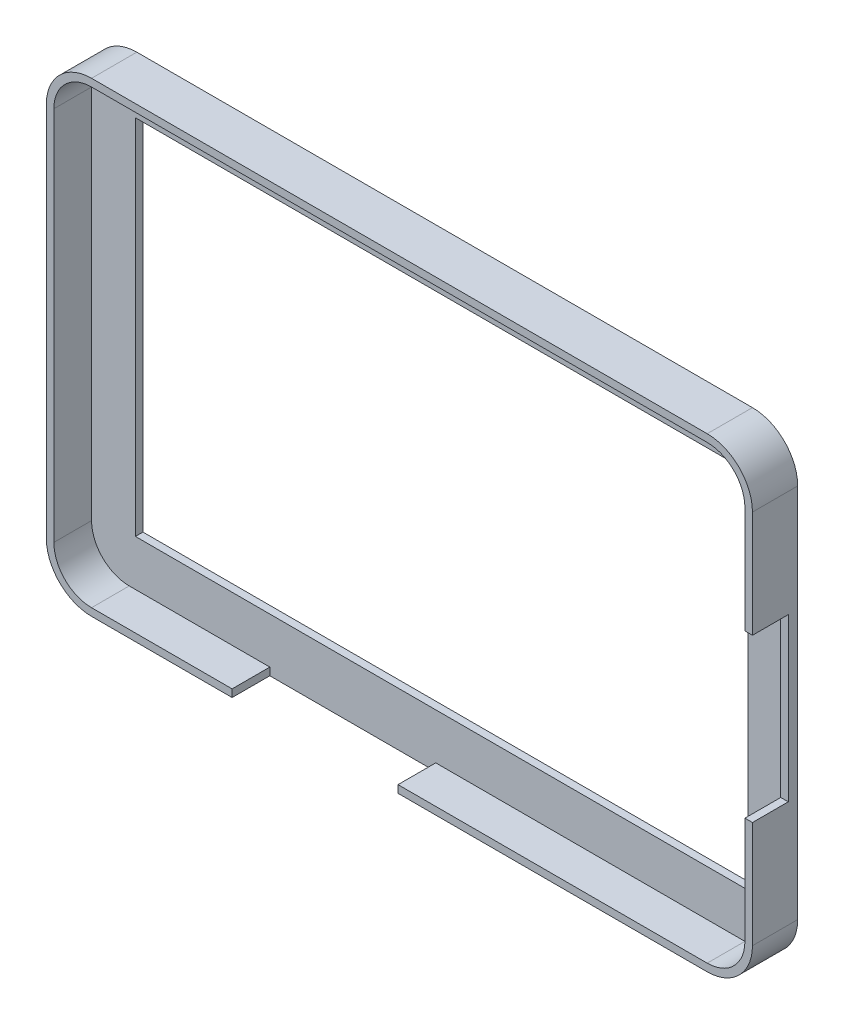
ISO-10303-21;
HEADER;
FILE_DESCRIPTION(('STEP AP214'),'2;1');
FILE_NAME('part.step','',(''),(''),'','','');
FILE_SCHEMA(('AUTOMOTIVE_DESIGN { 1 0 10303 214 1 1 1 1 }'));
ENDSEC;
DATA;
#1=APPLICATION_CONTEXT('core data for automotive mechanical design processes');
#2=APPLICATION_PROTOCOL_DEFINITION('international standard','automotive_design',2000,#1);
#3=PRODUCT_CONTEXT('',#1,'mechanical');
#4=PRODUCT('Part','Part','',(#3));
#5=PRODUCT_RELATED_PRODUCT_CATEGORY('part','',(#4));
#6=PRODUCT_DEFINITION_FORMATION('','',#4);
#7=PRODUCT_DEFINITION_CONTEXT('part definition',#1,'design');
#8=PRODUCT_DEFINITION('design','',#6,#7);
#9=PRODUCT_DEFINITION_SHAPE('','',#8);
#10=(LENGTH_UNIT() NAMED_UNIT(*) SI_UNIT(.MILLI.,.METRE.));
#11=(NAMED_UNIT(*) PLANE_ANGLE_UNIT() SI_UNIT($,.RADIAN.));
#12=(NAMED_UNIT(*) SI_UNIT($,.STERADIAN.) SOLID_ANGLE_UNIT());
#13=UNCERTAINTY_MEASURE_WITH_UNIT(LENGTH_MEASURE(1.E-05),#10,'distance_accuracy_value','');
#14=(GEOMETRIC_REPRESENTATION_CONTEXT(3) GLOBAL_UNCERTAINTY_ASSIGNED_CONTEXT((#13)) GLOBAL_UNIT_ASSIGNED_CONTEXT((#10,
#11,#12)) REPRESENTATION_CONTEXT('',''));
#15=CARTESIAN_POINT('',(0.,0.,0.));
#16=DIRECTION('',(0.,0.,1.));
#17=DIRECTION('',(1.,0.,0.));
#18=AXIS2_PLACEMENT_3D('',#15,#16,#17);
#19=CARTESIAN_POINT('',(46.82,-30.9,6.));
#20=DIRECTION('',(0.,1.,0.));
#21=DIRECTION('',(0.,0.,1.));
#22=AXIS2_PLACEMENT_3D('',#19,#20,#21);
#23=PLANE('',#22);
#24=DIRECTION('',(0.,0.,1.));
#25=VECTOR('',#24,1.);
#26=CARTESIAN_POINT('',(-0.18,-30.9,6.));
#27=LINE('',#26,#25);
#28=CARTESIAN_POINT('',(-0.18,-30.9,1.));
#29=VERTEX_POINT('',#28);
#30=CARTESIAN_POINT('',(-0.18,-30.9,6.));
#31=VERTEX_POINT('',#30);
#32=EDGE_CURVE('E249',#29,#31,#27,.T.);
#33=ORIENTED_EDGE('',*,*,#32,.F.);
#34=DIRECTION('',(1.,0.,0.));
#35=VECTOR('',#34,1.);
#36=CARTESIAN_POINT('',(-0.18,-30.9,1.));
#37=LINE('',#36,#35);
#38=CARTESIAN_POINT('',(-22.18,-30.9,0.999999999999997));
#39=VERTEX_POINT('',#38);
#40=EDGE_CURVE('E260',#39,#29,#37,.T.);
#41=ORIENTED_EDGE('',*,*,#40,.F.);
#42=DIRECTION('',(0.,0.,-1.));
#43=VECTOR('',#42,1.);
#44=CARTESIAN_POINT('',(-22.18,-30.9,6.));
#45=LINE('',#44,#43);
#46=CARTESIAN_POINT('',(-22.18,-30.9,6.));
#47=VERTEX_POINT('',#46);
#48=EDGE_CURVE('E255',#47,#39,#45,.T.);
#49=ORIENTED_EDGE('',*,*,#48,.F.);
#50=DIRECTION('',(1.,0.,0.));
#51=VECTOR('',#50,1.);
#52=CARTESIAN_POINT('',(46.82,-30.9,6.));
#53=LINE('',#52,#51);
#54=CARTESIAN_POINT('',(-40.82,-30.9,6.));
#55=VERTEX_POINT('',#54);
#56=EDGE_CURVE('E362',#55,#47,#53,.T.);
#57=ORIENTED_EDGE('',*,*,#56,.F.);
#58=DIRECTION('',(0.,0.,-1.));
#59=VECTOR('',#58,1.);
#60=CARTESIAN_POINT('',(-40.82,-30.9,6.));
#61=LINE('',#60,#59);
#62=CARTESIAN_POINT('',(-40.82,-30.9,0.));
#63=VERTEX_POINT('',#62);
#64=EDGE_CURVE('E395',#55,#63,#61,.T.);
#65=ORIENTED_EDGE('',*,*,#64,.T.);
#66=DIRECTION('',(1.,0.,0.));
#67=VECTOR('',#66,1.);
#68=CARTESIAN_POINT('',(46.82,-30.9,0.));
#69=LINE('',#68,#67);
#70=CARTESIAN_POINT('',(40.82,-30.9,0.));
#71=VERTEX_POINT('',#70);
#72=EDGE_CURVE('E374',#63,#71,#69,.T.);
#73=ORIENTED_EDGE('',*,*,#72,.T.);
#74=DIRECTION('',(0.,0.,-1.));
#75=VECTOR('',#74,1.);
#76=CARTESIAN_POINT('',(40.82,-30.9,6.));
#77=LINE('',#76,#75);
#78=CARTESIAN_POINT('',(40.82,-30.9,6.));
#79=VERTEX_POINT('',#78);
#80=EDGE_CURVE('E396',#71,#79,#77,.F.);
#81=ORIENTED_EDGE('',*,*,#80,.T.);
#82=EDGE_CURVE('E363',#31,#79,#53,.T.);
#83=ORIENTED_EDGE('',*,*,#82,.F.);
#84=EDGE_LOOP('',(#33,#41,#49,#57,#65,#73,#81,#83));
#85=FACE_BOUND('',#84,.T.);
#86=ADVANCED_FACE('F39',(#85),#23,.F.);
#87=CARTESIAN_POINT('',(0.,0.,6.));
#88=DIRECTION('',(0.,0.,-1.));
#89=DIRECTION('',(-1.,0.,0.));
#90=AXIS2_PLACEMENT_3D('',#87,#88,#89);
#91=PLANE('',#90);
#92=DIRECTION('',(0.,-1.,0.));
#93=VECTOR('',#92,1.);
#94=CARTESIAN_POINT('',(-22.18,-24.9,6.));
#95=LINE('',#94,#93);
#96=CARTESIAN_POINT('',(-22.18,-29.9,6.));
#97=VERTEX_POINT('',#96);
#98=EDGE_CURVE('E266',#97,#47,#95,.T.);
#99=ORIENTED_EDGE('',*,*,#98,.F.);
#100=DIRECTION('',(1.,0.,0.));
#101=VECTOR('',#100,1.);
#102=CARTESIAN_POINT('',(0.,-29.9,6.));
#103=LINE('',#102,#101);
#104=CARTESIAN_POINT('',(-40.82,-29.9,6.));
#105=VERTEX_POINT('',#104);
#106=EDGE_CURVE('E347',#105,#97,#103,.T.);
#107=ORIENTED_EDGE('',*,*,#106,.F.);
#108=CARTESIAN_POINT('',(-40.82,-24.9,6.));
#109=DIRECTION('',(0.,0.,-1.));
#110=DIRECTION('',(-1.,0.,0.));
#111=AXIS2_PLACEMENT_3D('',#108,#109,#110);
#112=CIRCLE('',#111,5.);
#113=CARTESIAN_POINT('',(-45.82,-24.9,6.));
#114=VERTEX_POINT('',#113);
#115=EDGE_CURVE('E345',#114,#105,#112,.F.);
#116=ORIENTED_EDGE('',*,*,#115,.F.);
#117=DIRECTION('',(0.,-1.,0.));
#118=VECTOR('',#117,1.);
#119=CARTESIAN_POINT('',(-45.82,0.,6.));
#120=LINE('',#119,#118);
#121=CARTESIAN_POINT('',(-45.82,24.9,6.));
#122=VERTEX_POINT('',#121);
#123=EDGE_CURVE('E336',#122,#114,#120,.T.);
#124=ORIENTED_EDGE('',*,*,#123,.F.);
#125=CARTESIAN_POINT('',(-40.82,24.9,6.));
#126=DIRECTION('',(0.,0.,-1.));
#127=DIRECTION('',(-1.,0.,0.));
#128=AXIS2_PLACEMENT_3D('',#125,#126,#127);
#129=CIRCLE('',#128,5.);
#130=CARTESIAN_POINT('',(-40.82,29.9,6.));
#131=VERTEX_POINT('',#130);
#132=EDGE_CURVE('E338',#131,#122,#129,.F.);
#133=ORIENTED_EDGE('',*,*,#132,.F.);
#134=DIRECTION('',(-1.,0.,0.));
#135=VECTOR('',#134,1.);
#136=CARTESIAN_POINT('',(0.,29.9,6.));
#137=LINE('',#136,#135);
#138=CARTESIAN_POINT('',(40.82,29.9,6.));
#139=VERTEX_POINT('',#138);
#140=EDGE_CURVE('E301',#139,#131,#137,.T.);
#141=ORIENTED_EDGE('',*,*,#140,.F.);
#142=CARTESIAN_POINT('',(40.82,24.9,6.));
#143=DIRECTION('',(0.,0.,-1.));
#144=DIRECTION('',(-1.,0.,0.));
#145=AXIS2_PLACEMENT_3D('',#142,#143,#144);
#146=CIRCLE('',#145,5.);
#147=CARTESIAN_POINT('',(45.82,24.9,6.));
#148=VERTEX_POINT('',#147);
#149=EDGE_CURVE('E329',#148,#139,#146,.F.);
#150=ORIENTED_EDGE('',*,*,#149,.F.);
#151=DIRECTION('',(0.,1.,0.));
#152=VECTOR('',#151,1.);
#153=CARTESIAN_POINT('',(45.82,0.,6.));
#154=LINE('',#153,#152);
#155=CARTESIAN_POINT('',(45.82,10.75,6.));
#156=VERTEX_POINT('',#155);
#157=EDGE_CURVE('E349',#156,#148,#154,.T.);
#158=ORIENTED_EDGE('',*,*,#157,.F.);
#159=DIRECTION('',(1.,0.,0.));
#160=VECTOR('',#159,1.);
#161=CARTESIAN_POINT('',(0.,10.75,6.));
#162=LINE('',#161,#160);
#163=CARTESIAN_POINT('',(46.82,10.75,6.));
#164=VERTEX_POINT('',#163);
#165=EDGE_CURVE('E281',#156,#164,#162,.T.);
#166=ORIENTED_EDGE('',*,*,#165,.T.);
#167=DIRECTION('',(0.,1.,0.));
#168=VECTOR('',#167,1.);
#169=CARTESIAN_POINT('',(46.82,-30.9,6.));
#170=LINE('',#169,#168);
#171=CARTESIAN_POINT('',(46.82,24.9,6.));
#172=VERTEX_POINT('',#171);
#173=EDGE_CURVE('E364',#164,#172,#170,.T.);
#174=ORIENTED_EDGE('',*,*,#173,.T.);
#175=CARTESIAN_POINT('',(40.82,24.9,6.));
#176=DIRECTION('',(0.,0.,-1.));
#177=DIRECTION('',(-1.,0.,0.));
#178=AXIS2_PLACEMENT_3D('',#175,#176,#177);
#179=CIRCLE('',#178,6.);
#180=CARTESIAN_POINT('',(40.82,30.9,6.));
#181=VERTEX_POINT('',#180);
#182=EDGE_CURVE('E397',#172,#181,#179,.F.);
#183=ORIENTED_EDGE('',*,*,#182,.T.);
#184=DIRECTION('',(-1.,0.,0.));
#185=VECTOR('',#184,1.);
#186=CARTESIAN_POINT('',(46.82,30.9,6.));
#187=LINE('',#186,#185);
#188=CARTESIAN_POINT('',(-40.82,30.9,6.));
#189=VERTEX_POINT('',#188);
#190=EDGE_CURVE('E351',#181,#189,#187,.T.);
#191=ORIENTED_EDGE('',*,*,#190,.T.);
#192=CARTESIAN_POINT('',(-40.82,24.9,6.));
#193=DIRECTION('',(0.,0.,-1.));
#194=DIRECTION('',(-1.,0.,0.));
#195=AXIS2_PLACEMENT_3D('',#192,#193,#194);
#196=CIRCLE('',#195,6.);
#197=CARTESIAN_POINT('',(-46.82,24.9,6.));
#198=VERTEX_POINT('',#197);
#199=EDGE_CURVE('E402',#189,#198,#196,.F.);
#200=ORIENTED_EDGE('',*,*,#199,.T.);
#201=DIRECTION('',(0.,-1.,0.));
#202=VECTOR('',#201,1.);
#203=CARTESIAN_POINT('',(-46.82,-30.9,6.));
#204=LINE('',#203,#202);
#205=CARTESIAN_POINT('',(-46.82,-24.9,6.));
#206=VERTEX_POINT('',#205);
#207=EDGE_CURVE('E360',#198,#206,#204,.T.);
#208=ORIENTED_EDGE('',*,*,#207,.T.);
#209=CARTESIAN_POINT('',(-40.82,-24.9,6.));
#210=DIRECTION('',(0.,0.,-1.));
#211=DIRECTION('',(-1.,0.,0.));
#212=AXIS2_PLACEMENT_3D('',#209,#210,#211);
#213=CIRCLE('',#212,6.);
#214=EDGE_CURVE('E401',#206,#55,#213,.F.);
#215=ORIENTED_EDGE('',*,*,#214,.T.);
#216=ORIENTED_EDGE('',*,*,#56,.T.);
#217=EDGE_LOOP('',(#99,#107,#116,#124,#133,#141,#150,#158,#166,#174,#183,#191,#200,#208,#215,#216));
#218=FACE_BOUND('',#217,.T.);
#219=ADVANCED_FACE('F455',(#218),#91,.F.);
#220=CARTESIAN_POINT('',(46.82,-29.9,6.));
#221=DIRECTION('',(0.,1.,0.));
#222=DIRECTION('',(0.,0.,1.));
#223=AXIS2_PLACEMENT_3D('',#220,#221,#222);
#224=PLANE('',#223);
#225=DIRECTION('',(0.,0.,-1.));
#226=VECTOR('',#225,1.);
#227=CARTESIAN_POINT('',(-0.18,-29.9,6.));
#228=LINE('',#227,#226);
#229=CARTESIAN_POINT('',(-0.18,-29.9,6.));
#230=VERTEX_POINT('',#229);
#231=CARTESIAN_POINT('',(-0.18,-29.9,1.));
#232=VERTEX_POINT('',#231);
#233=EDGE_CURVE('E426',#230,#232,#228,.T.);
#234=ORIENTED_EDGE('',*,*,#233,.F.);
#235=CARTESIAN_POINT('',(40.82,-29.9,6.));
#236=VERTEX_POINT('',#235);
#237=EDGE_CURVE('E342',#230,#236,#103,.T.);
#238=ORIENTED_EDGE('',*,*,#237,.T.);
#239=DIRECTION('',(0.,0.,1.));
#240=VECTOR('',#239,1.);
#241=CARTESIAN_POINT('',(40.82,-29.9,6.));
#242=LINE('',#241,#240);
#243=CARTESIAN_POINT('',(40.82,-29.9,1.));
#244=VERTEX_POINT('',#243);
#245=EDGE_CURVE('E330',#244,#236,#242,.T.);
#246=ORIENTED_EDGE('',*,*,#245,.F.);
#247=DIRECTION('',(1.,0.,0.));
#248=VECTOR('',#247,1.);
#249=CARTESIAN_POINT('',(0.,-29.9,1.));
#250=LINE('',#249,#248);
#251=EDGE_CURVE('E309',#232,#244,#250,.T.);
#252=ORIENTED_EDGE('',*,*,#251,.F.);
#253=EDGE_LOOP('',(#234,#238,#246,#252));
#254=FACE_BOUND('',#253,.T.);
#255=ADVANCED_FACE('F459',(#254),#224,.T.);
#256=CARTESIAN_POINT('',(46.82,-30.9,6.));
#257=DIRECTION('',(-1.,0.,0.));
#258=DIRECTION('',(0.,0.,1.));
#259=AXIS2_PLACEMENT_3D('',#256,#257,#258);
#260=PLANE('',#259);
#261=DIRECTION('',(0.,0.,1.));
#262=VECTOR('',#261,1.);
#263=CARTESIAN_POINT('',(46.82,10.75,10.75));
#264=LINE('',#263,#262);
#265=CARTESIAN_POINT('',(46.82,10.75,1.25));
#266=VERTEX_POINT('',#265);
#267=EDGE_CURVE('E263',#266,#164,#264,.T.);
#268=ORIENTED_EDGE('',*,*,#267,.F.);
#269=DIRECTION('',(0.,1.,0.));
#270=VECTOR('',#269,1.);
#271=CARTESIAN_POINT('',(46.82,-10.75,1.25));
#272=LINE('',#271,#270);
#273=CARTESIAN_POINT('',(46.82,-10.75,1.25));
#274=VERTEX_POINT('',#273);
#275=EDGE_CURVE('E273',#274,#266,#272,.T.);
#276=ORIENTED_EDGE('',*,*,#275,.F.);
#277=DIRECTION('',(0.,0.,-1.));
#278=VECTOR('',#277,1.);
#279=CARTESIAN_POINT('',(46.82,-10.75,10.75));
#280=LINE('',#279,#278);
#281=CARTESIAN_POINT('',(46.82,-10.75,6.));
#282=VERTEX_POINT('',#281);
#283=EDGE_CURVE('E271',#282,#274,#280,.T.);
#284=ORIENTED_EDGE('',*,*,#283,.F.);
#285=CARTESIAN_POINT('',(46.82,-24.9,6.));
#286=VERTEX_POINT('',#285);
#287=EDGE_CURVE('E368',#286,#282,#170,.T.);
#288=ORIENTED_EDGE('',*,*,#287,.F.);
#289=DIRECTION('',(0.,0.,-1.));
#290=VECTOR('',#289,1.);
#291=CARTESIAN_POINT('',(46.82,-24.9,6.));
#292=LINE('',#291,#290);
#293=CARTESIAN_POINT('',(46.82,-24.9,0.));
#294=VERTEX_POINT('',#293);
#295=EDGE_CURVE('E385',#286,#294,#292,.T.);
#296=ORIENTED_EDGE('',*,*,#295,.T.);
#297=DIRECTION('',(0.,1.,0.));
#298=VECTOR('',#297,1.);
#299=CARTESIAN_POINT('',(46.82,-30.9,0.));
#300=LINE('',#299,#298);
#301=CARTESIAN_POINT('',(46.82,24.9,0.));
#302=VERTEX_POINT('',#301);
#303=EDGE_CURVE('E358',#294,#302,#300,.T.);
#304=ORIENTED_EDGE('',*,*,#303,.T.);
#305=DIRECTION('',(0.,0.,-1.));
#306=VECTOR('',#305,1.);
#307=CARTESIAN_POINT('',(46.82,24.9,6.));
#308=LINE('',#307,#306);
#309=EDGE_CURVE('E369',#302,#172,#308,.F.);
#310=ORIENTED_EDGE('',*,*,#309,.T.);
#311=ORIENTED_EDGE('',*,*,#173,.F.);
#312=EDGE_LOOP('',(#268,#276,#284,#288,#296,#304,#310,#311));
#313=FACE_BOUND('',#312,.T.);
#314=ADVANCED_FACE('F466',(#313),#260,.F.);
#315=CARTESIAN_POINT('',(46.82,30.9,6.));
#316=DIRECTION('',(0.,-1.,0.));
#317=DIRECTION('',(0.,0.,-1.));
#318=AXIS2_PLACEMENT_3D('',#315,#316,#317);
#319=PLANE('',#318);
#320=DIRECTION('',(-1.,0.,0.));
#321=VECTOR('',#320,1.);
#322=CARTESIAN_POINT('',(46.82,30.9,0.));
#323=LINE('',#322,#321);
#324=CARTESIAN_POINT('',(40.82,30.9,0.));
#325=VERTEX_POINT('',#324);
#326=CARTESIAN_POINT('',(-40.82,30.9,0.));
#327=VERTEX_POINT('',#326);
#328=EDGE_CURVE('E291',#325,#327,#323,.T.);
#329=ORIENTED_EDGE('',*,*,#328,.T.);
#330=DIRECTION('',(0.,0.,-1.));
#331=VECTOR('',#330,1.);
#332=CARTESIAN_POINT('',(-40.82,30.9,6.));
#333=LINE('',#332,#331);
#334=EDGE_CURVE('E414',#327,#189,#333,.F.);
#335=ORIENTED_EDGE('',*,*,#334,.T.);
#336=ORIENTED_EDGE('',*,*,#190,.F.);
#337=DIRECTION('',(0.,0.,-1.));
#338=VECTOR('',#337,1.);
#339=CARTESIAN_POINT('',(40.82,30.9,6.));
#340=LINE('',#339,#338);
#341=EDGE_CURVE('E415',#181,#325,#340,.T.);
#342=ORIENTED_EDGE('',*,*,#341,.T.);
#343=EDGE_LOOP('',(#329,#335,#336,#342));
#344=FACE_BOUND('',#343,.T.);
#345=ADVANCED_FACE('F473',(#344),#319,.F.);
#346=CARTESIAN_POINT('',(-46.82,-30.9,6.));
#347=DIRECTION('',(1.,0.,0.));
#348=DIRECTION('',(0.,0.,-1.));
#349=AXIS2_PLACEMENT_3D('',#346,#347,#348);
#350=PLANE('',#349);
#351=DIRECTION('',(0.,-1.,0.));
#352=VECTOR('',#351,1.);
#353=CARTESIAN_POINT('',(-46.82,-30.9,0.));
#354=LINE('',#353,#352);
#355=CARTESIAN_POINT('',(-46.82,24.9,0.));
#356=VERTEX_POINT('',#355);
#357=CARTESIAN_POINT('',(-46.82,-24.9,0.));
#358=VERTEX_POINT('',#357);
#359=EDGE_CURVE('E375',#356,#358,#354,.T.);
#360=ORIENTED_EDGE('',*,*,#359,.T.);
#361=DIRECTION('',(0.,0.,-1.));
#362=VECTOR('',#361,1.);
#363=CARTESIAN_POINT('',(-46.82,-24.9,6.));
#364=LINE('',#363,#362);
#365=EDGE_CURVE('E408',#358,#206,#364,.F.);
#366=ORIENTED_EDGE('',*,*,#365,.T.);
#367=ORIENTED_EDGE('',*,*,#207,.F.);
#368=DIRECTION('',(0.,0.,-1.));
#369=VECTOR('',#368,1.);
#370=CARTESIAN_POINT('',(-46.82,24.9,6.));
#371=LINE('',#370,#369);
#372=EDGE_CURVE('E409',#198,#356,#371,.T.);
#373=ORIENTED_EDGE('',*,*,#372,.T.);
#374=EDGE_LOOP('',(#360,#366,#367,#373));
#375=FACE_BOUND('',#374,.T.);
#376=ADVANCED_FACE('F468',(#375),#350,.F.);
#377=ORIENTED_EDGE('',*,*,#237,.F.);
#378=DIRECTION('',(0.,-1.,0.));
#379=VECTOR('',#378,1.);
#380=CARTESIAN_POINT('',(-0.18,-24.9,6.));
#381=LINE('',#380,#379);
#382=EDGE_CURVE('E257',#230,#31,#381,.T.);
#383=ORIENTED_EDGE('',*,*,#382,.T.);
#384=ORIENTED_EDGE('',*,*,#82,.T.);
#385=CARTESIAN_POINT('',(40.82,-24.9,6.));
#386=DIRECTION('',(0.,0.,-1.));
#387=DIRECTION('',(-1.,0.,0.));
#388=AXIS2_PLACEMENT_3D('',#385,#386,#387);
#389=CIRCLE('',#388,6.);
#390=EDGE_CURVE('E403',#79,#286,#389,.F.);
#391=ORIENTED_EDGE('',*,*,#390,.T.);
#392=ORIENTED_EDGE('',*,*,#287,.T.);
#393=DIRECTION('',(-1.,0.,0.));
#394=VECTOR('',#393,1.);
#395=CARTESIAN_POINT('',(0.,-10.75,6.));
#396=LINE('',#395,#394);
#397=CARTESIAN_POINT('',(45.82,-10.75,6.));
#398=VERTEX_POINT('',#397);
#399=EDGE_CURVE('E278',#282,#398,#396,.T.);
#400=ORIENTED_EDGE('',*,*,#399,.T.);
#401=CARTESIAN_POINT('',(45.82,-24.9,6.));
#402=VERTEX_POINT('',#401);
#403=EDGE_CURVE('E337',#402,#398,#154,.T.);
#404=ORIENTED_EDGE('',*,*,#403,.F.);
#405=CARTESIAN_POINT('',(40.82,-24.9,6.));
#406=DIRECTION('',(0.,0.,-1.));
#407=DIRECTION('',(-1.,0.,0.));
#408=AXIS2_PLACEMENT_3D('',#405,#406,#407);
#409=CIRCLE('',#408,5.);
#410=EDGE_CURVE('E322',#236,#402,#409,.F.);
#411=ORIENTED_EDGE('',*,*,#410,.F.);
#412=EDGE_LOOP('',(#377,#383,#384,#391,#392,#400,#404,#411));
#413=FACE_BOUND('',#412,.T.);
#414=ADVANCED_FACE('F464',(#413),#91,.F.);
#415=CARTESIAN_POINT('',(0.,0.,0.));
#416=DIRECTION('',(0.,0.,-1.));
#417=DIRECTION('',(-1.,0.,0.));
#418=AXIS2_PLACEMENT_3D('',#415,#416,#417);
#419=PLANE('',#418);
#420=DIRECTION('',(0.,1.,0.));
#421=VECTOR('',#420,1.);
#422=CARTESIAN_POINT('',(-40.0035200534595,-23.8079576976516,0.));
#423=LINE('',#422,#421);
#424=CARTESIAN_POINT('',(-40.0035200534595,-23.8079576976516,0.));
#425=VERTEX_POINT('',#424);
#426=CARTESIAN_POINT('',(-40.0035200534595,24.2769704066037,0.));
#427=VERTEX_POINT('',#426);
#428=EDGE_CURVE('E53',#425,#427,#423,.T.);
#429=ORIENTED_EDGE('',*,*,#428,.F.);
#430=DIRECTION('',(-1.,0.,0.));
#431=VECTOR('',#430,1.);
#432=CARTESIAN_POINT('',(-40.0035200534595,-23.8079576976516,0.));
#433=LINE('',#432,#431);
#434=CARTESIAN_POINT('',(41.2522942831432,-23.8079576976516,0.));
#435=VERTEX_POINT('',#434);
#436=EDGE_CURVE('E245',#435,#425,#433,.T.);
#437=ORIENTED_EDGE('',*,*,#436,.F.);
#438=DIRECTION('',(0.,-1.,0.));
#439=VECTOR('',#438,1.);
#440=CARTESIAN_POINT('',(41.2522942831432,-23.8079576976516,0.));
#441=LINE('',#440,#439);
#442=CARTESIAN_POINT('',(41.2522942831432,24.2769704066037,0.));
#443=VERTEX_POINT('',#442);
#444=EDGE_CURVE('E229',#443,#435,#441,.T.);
#445=ORIENTED_EDGE('',*,*,#444,.F.);
#446=DIRECTION('',(1.,0.,0.));
#447=VECTOR('',#446,1.);
#448=CARTESIAN_POINT('',(-40.0035200534595,24.2769704066037,0.));
#449=LINE('',#448,#447);
#450=EDGE_CURVE('E237',#427,#443,#449,.T.);
#451=ORIENTED_EDGE('',*,*,#450,.F.);
#452=EDGE_LOOP('',(#429,#437,#445,#451));
#453=FACE_BOUND('',#452,.T.);
#454=ORIENTED_EDGE('',*,*,#303,.F.);
#455=CARTESIAN_POINT('',(40.82,-24.9,0.));
#456=DIRECTION('',(0.,0.,-1.));
#457=DIRECTION('',(-1.,0.,0.));
#458=AXIS2_PLACEMENT_3D('',#455,#456,#457);
#459=CIRCLE('',#458,6.);
#460=EDGE_CURVE('E392',#294,#71,#459,.T.);
#461=ORIENTED_EDGE('',*,*,#460,.T.);
#462=ORIENTED_EDGE('',*,*,#72,.F.);
#463=CARTESIAN_POINT('',(-40.82,-24.9,0.));
#464=DIRECTION('',(0.,0.,-1.));
#465=DIRECTION('',(-1.,0.,0.));
#466=AXIS2_PLACEMENT_3D('',#463,#464,#465);
#467=CIRCLE('',#466,6.);
#468=EDGE_CURVE('E386',#63,#358,#467,.T.);
#469=ORIENTED_EDGE('',*,*,#468,.T.);
#470=ORIENTED_EDGE('',*,*,#359,.F.);
#471=CARTESIAN_POINT('',(-40.82,24.9,0.));
#472=DIRECTION('',(0.,0.,-1.));
#473=DIRECTION('',(-1.,0.,0.));
#474=AXIS2_PLACEMENT_3D('',#471,#472,#473);
#475=CIRCLE('',#474,6.);
#476=EDGE_CURVE('E390',#356,#327,#475,.T.);
#477=ORIENTED_EDGE('',*,*,#476,.T.);
#478=ORIENTED_EDGE('',*,*,#328,.F.);
#479=CARTESIAN_POINT('',(40.82,24.9,0.));
#480=DIRECTION('',(0.,0.,-1.));
#481=DIRECTION('',(-1.,0.,0.));
#482=AXIS2_PLACEMENT_3D('',#479,#480,#481);
#483=CIRCLE('',#482,6.);
#484=EDGE_CURVE('E384',#325,#302,#483,.T.);
#485=ORIENTED_EDGE('',*,*,#484,.T.);
#486=EDGE_LOOP('',(#454,#461,#462,#469,#470,#477,#478,#485));
#487=FACE_BOUND('',#486,.T.);
#488=ADVANCED_FACE('F238',(#453,#487),#419,.T.);
#489=CARTESIAN_POINT('',(40.82,-24.9,6.));
#490=DIRECTION('',(0.,0.,-1.));
#491=DIRECTION('',(-1.,0.,0.));
#492=AXIS2_PLACEMENT_3D('',#489,#490,#491);
#493=CYLINDRICAL_SURFACE('',#492,6.);
#494=ORIENTED_EDGE('',*,*,#390,.F.);
#495=ORIENTED_EDGE('',*,*,#80,.F.);
#496=ORIENTED_EDGE('',*,*,#460,.F.);
#497=ORIENTED_EDGE('',*,*,#295,.F.);
#498=EDGE_LOOP('',(#494,#495,#496,#497));
#499=FACE_BOUND('',#498,.T.);
#500=ADVANCED_FACE('F478',(#499),#493,.T.);
#501=CARTESIAN_POINT('',(-40.82,-24.9,6.));
#502=DIRECTION('',(0.,0.,-1.));
#503=DIRECTION('',(-1.,0.,0.));
#504=AXIS2_PLACEMENT_3D('',#501,#502,#503);
#505=CYLINDRICAL_SURFACE('',#504,6.);
#506=ORIENTED_EDGE('',*,*,#214,.F.);
#507=ORIENTED_EDGE('',*,*,#365,.F.);
#508=ORIENTED_EDGE('',*,*,#468,.F.);
#509=ORIENTED_EDGE('',*,*,#64,.F.);
#510=EDGE_LOOP('',(#506,#507,#508,#509));
#511=FACE_BOUND('',#510,.T.);
#512=ADVANCED_FACE('F479',(#511),#505,.T.);
#513=CARTESIAN_POINT('',(-40.82,24.9,6.));
#514=DIRECTION('',(0.,0.,-1.));
#515=DIRECTION('',(-1.,0.,0.));
#516=AXIS2_PLACEMENT_3D('',#513,#514,#515);
#517=CYLINDRICAL_SURFACE('',#516,6.);
#518=ORIENTED_EDGE('',*,*,#199,.F.);
#519=ORIENTED_EDGE('',*,*,#334,.F.);
#520=ORIENTED_EDGE('',*,*,#476,.F.);
#521=ORIENTED_EDGE('',*,*,#372,.F.);
#522=EDGE_LOOP('',(#518,#519,#520,#521));
#523=FACE_BOUND('',#522,.T.);
#524=ADVANCED_FACE('F485',(#523),#517,.T.);
#525=CARTESIAN_POINT('',(40.82,24.9,6.));
#526=DIRECTION('',(0.,0.,-1.));
#527=DIRECTION('',(-1.,0.,0.));
#528=AXIS2_PLACEMENT_3D('',#525,#526,#527);
#529=CYLINDRICAL_SURFACE('',#528,6.);
#530=ORIENTED_EDGE('',*,*,#182,.F.);
#531=ORIENTED_EDGE('',*,*,#309,.F.);
#532=ORIENTED_EDGE('',*,*,#484,.F.);
#533=ORIENTED_EDGE('',*,*,#341,.F.);
#534=EDGE_LOOP('',(#530,#531,#532,#533));
#535=FACE_BOUND('',#534,.T.);
#536=ADVANCED_FACE('F41',(#535),#529,.T.);
#537=CARTESIAN_POINT('',(46.82,29.9,6.));
#538=DIRECTION('',(0.,-1.,0.));
#539=DIRECTION('',(0.,0.,-1.));
#540=AXIS2_PLACEMENT_3D('',#537,#538,#539);
#541=PLANE('',#540);
#542=DIRECTION('',(-1.,0.,0.));
#543=VECTOR('',#542,1.);
#544=CARTESIAN_POINT('',(0.,29.9,1.));
#545=LINE('',#544,#543);
#546=CARTESIAN_POINT('',(40.82,29.9,1.));
#547=VERTEX_POINT('',#546);
#548=CARTESIAN_POINT('',(-40.82,29.9,1.));
#549=VERTEX_POINT('',#548);
#550=EDGE_CURVE('E290',#547,#549,#545,.T.);
#551=ORIENTED_EDGE('',*,*,#550,.F.);
#552=DIRECTION('',(0.,0.,-1.));
#553=VECTOR('',#552,1.);
#554=CARTESIAN_POINT('',(40.82,29.9,6.));
#555=LINE('',#554,#553);
#556=EDGE_CURVE('E294',#139,#547,#555,.T.);
#557=ORIENTED_EDGE('',*,*,#556,.F.);
#558=ORIENTED_EDGE('',*,*,#140,.T.);
#559=DIRECTION('',(0.,0.,-1.));
#560=VECTOR('',#559,1.);
#561=CARTESIAN_POINT('',(-40.82,29.9,6.));
#562=LINE('',#561,#560);
#563=EDGE_CURVE('E292',#549,#131,#562,.F.);
#564=ORIENTED_EDGE('',*,*,#563,.F.);
#565=EDGE_LOOP('',(#551,#557,#558,#564));
#566=FACE_BOUND('',#565,.T.);
#567=ADVANCED_FACE('F487',(#566),#541,.T.);
#568=CARTESIAN_POINT('',(-45.82,-30.9,6.));
#569=DIRECTION('',(1.,0.,0.));
#570=DIRECTION('',(0.,0.,-1.));
#571=AXIS2_PLACEMENT_3D('',#568,#569,#570);
#572=PLANE('',#571);
#573=DIRECTION('',(0.,-1.,0.));
#574=VECTOR('',#573,1.);
#575=CARTESIAN_POINT('',(-45.82,0.,1.));
#576=LINE('',#575,#574);
#577=CARTESIAN_POINT('',(-45.82,24.9,1.));
#578=VERTEX_POINT('',#577);
#579=CARTESIAN_POINT('',(-45.82,-24.9,1.));
#580=VERTEX_POINT('',#579);
#581=EDGE_CURVE('E289',#578,#580,#576,.T.);
#582=ORIENTED_EDGE('',*,*,#581,.F.);
#583=DIRECTION('',(0.,0.,-1.));
#584=VECTOR('',#583,1.);
#585=CARTESIAN_POINT('',(-45.82,24.9,6.));
#586=LINE('',#585,#584);
#587=EDGE_CURVE('E321',#122,#578,#586,.T.);
#588=ORIENTED_EDGE('',*,*,#587,.F.);
#589=ORIENTED_EDGE('',*,*,#123,.T.);
#590=DIRECTION('',(0.,0.,-1.));
#591=VECTOR('',#590,1.);
#592=CARTESIAN_POINT('',(-45.82,-24.9,6.));
#593=LINE('',#592,#591);
#594=EDGE_CURVE('E299',#580,#114,#593,.F.);
#595=ORIENTED_EDGE('',*,*,#594,.F.);
#596=EDGE_LOOP('',(#582,#588,#589,#595));
#597=FACE_BOUND('',#596,.T.);
#598=ADVANCED_FACE('F521',(#597),#572,.T.);
#599=DIRECTION('',(0.,0.,1.));
#600=VECTOR('',#599,1.);
#601=CARTESIAN_POINT('',(-22.18,-29.9,6.));
#602=LINE('',#601,#600);
#603=CARTESIAN_POINT('',(-22.18,-29.9,1.));
#604=VERTEX_POINT('',#603);
#605=EDGE_CURVE('E424',#604,#97,#602,.T.);
#606=ORIENTED_EDGE('',*,*,#605,.F.);
#607=CARTESIAN_POINT('',(-40.82,-29.9,1.));
#608=VERTEX_POINT('',#607);
#609=EDGE_CURVE('E305',#608,#604,#250,.T.);
#610=ORIENTED_EDGE('',*,*,#609,.F.);
#611=DIRECTION('',(0.,0.,1.));
#612=VECTOR('',#611,1.);
#613=CARTESIAN_POINT('',(-40.82,-29.9,6.));
#614=LINE('',#613,#612);
#615=EDGE_CURVE('E308',#105,#608,#614,.F.);
#616=ORIENTED_EDGE('',*,*,#615,.F.);
#617=ORIENTED_EDGE('',*,*,#106,.T.);
#618=EDGE_LOOP('',(#606,#610,#616,#617));
#619=FACE_BOUND('',#618,.T.);
#620=ADVANCED_FACE('F509',(#619),#224,.T.);
#621=CARTESIAN_POINT('',(45.82,-30.9,6.));
#622=DIRECTION('',(-1.,0.,0.));
#623=DIRECTION('',(0.,0.,1.));
#624=AXIS2_PLACEMENT_3D('',#621,#622,#623);
#625=PLANE('',#624);
#626=DIRECTION('',(0.,0.,-1.));
#627=VECTOR('',#626,1.);
#628=CARTESIAN_POINT('',(45.82,10.75,6.00000000000001));
#629=LINE('',#628,#627);
#630=CARTESIAN_POINT('',(45.82,10.75,1.25));
#631=VERTEX_POINT('',#630);
#632=EDGE_CURVE('E425',#156,#631,#629,.T.);
#633=ORIENTED_EDGE('',*,*,#632,.F.);
#634=ORIENTED_EDGE('',*,*,#157,.T.);
#635=DIRECTION('',(0.,0.,1.));
#636=VECTOR('',#635,1.);
#637=CARTESIAN_POINT('',(45.82,24.9,6.));
#638=LINE('',#637,#636);
#639=CARTESIAN_POINT('',(45.82,24.9,1.));
#640=VERTEX_POINT('',#639);
#641=EDGE_CURVE('E334',#640,#148,#638,.T.);
#642=ORIENTED_EDGE('',*,*,#641,.F.);
#643=DIRECTION('',(0.,1.,0.));
#644=VECTOR('',#643,1.);
#645=CARTESIAN_POINT('',(45.82,0.,1.));
#646=LINE('',#645,#644);
#647=CARTESIAN_POINT('',(45.82,-24.9,1.));
#648=VERTEX_POINT('',#647);
#649=EDGE_CURVE('E300',#648,#640,#646,.T.);
#650=ORIENTED_EDGE('',*,*,#649,.F.);
#651=DIRECTION('',(0.,0.,1.));
#652=VECTOR('',#651,1.);
#653=CARTESIAN_POINT('',(45.82,-24.9,6.));
#654=LINE('',#653,#652);
#655=EDGE_CURVE('E318',#402,#648,#654,.F.);
#656=ORIENTED_EDGE('',*,*,#655,.F.);
#657=ORIENTED_EDGE('',*,*,#403,.T.);
#658=DIRECTION('',(0.,0.,1.));
#659=VECTOR('',#658,1.);
#660=CARTESIAN_POINT('',(45.82,-10.75,6.));
#661=LINE('',#660,#659);
#662=CARTESIAN_POINT('',(45.82,-10.75,1.25));
#663=VERTEX_POINT('',#662);
#664=EDGE_CURVE('E417',#663,#398,#661,.T.);
#665=ORIENTED_EDGE('',*,*,#664,.F.);
#666=DIRECTION('',(0.,-1.,0.));
#667=VECTOR('',#666,1.);
#668=CARTESIAN_POINT('',(45.82,-30.9,1.25));
#669=LINE('',#668,#667);
#670=EDGE_CURVE('E420',#631,#663,#669,.T.);
#671=ORIENTED_EDGE('',*,*,#670,.F.);
#672=EDGE_LOOP('',(#633,#634,#642,#650,#656,#657,#665,#671));
#673=FACE_BOUND('',#672,.T.);
#674=ADVANCED_FACE('F536',(#673),#625,.T.);
#675=CARTESIAN_POINT('',(0.,0.,1.));
#676=DIRECTION('',(0.,0.,-1.));
#677=DIRECTION('',(-1.,0.,0.));
#678=AXIS2_PLACEMENT_3D('',#675,#676,#677);
#679=PLANE('',#678);
#680=DIRECTION('',(-1.,0.,0.));
#681=VECTOR('',#680,1.);
#682=CARTESIAN_POINT('',(0.,-23.8079576976516,1.));
#683=LINE('',#682,#681);
#684=CARTESIAN_POINT('',(41.2522942831432,-23.8079576976516,1.));
#685=VERTEX_POINT('',#684);
#686=CARTESIAN_POINT('',(-40.0035200534595,-23.8079576976516,1.));
#687=VERTEX_POINT('',#686);
#688=EDGE_CURVE('E50',#685,#687,#683,.T.);
#689=ORIENTED_EDGE('',*,*,#688,.T.);
#690=DIRECTION('',(0.,1.,0.));
#691=VECTOR('',#690,1.);
#692=CARTESIAN_POINT('',(-40.0035200534595,0.,1.));
#693=LINE('',#692,#691);
#694=CARTESIAN_POINT('',(-40.0035200534595,24.2769704066037,1.));
#695=VERTEX_POINT('',#694);
#696=EDGE_CURVE('E11',#687,#695,#693,.T.);
#697=ORIENTED_EDGE('',*,*,#696,.T.);
#698=DIRECTION('',(1.,0.,0.));
#699=VECTOR('',#698,1.);
#700=CARTESIAN_POINT('',(0.,24.2769704066037,1.));
#701=LINE('',#700,#699);
#702=CARTESIAN_POINT('',(41.2522942831432,24.2769704066037,1.));
#703=VERTEX_POINT('',#702);
#704=EDGE_CURVE('E428',#695,#703,#701,.T.);
#705=ORIENTED_EDGE('',*,*,#704,.T.);
#706=DIRECTION('',(0.,-1.,0.));
#707=VECTOR('',#706,1.);
#708=CARTESIAN_POINT('',(41.2522942831432,0.,1.));
#709=LINE('',#708,#707);
#710=EDGE_CURVE('E228',#703,#685,#709,.T.);
#711=ORIENTED_EDGE('',*,*,#710,.T.);
#712=EDGE_LOOP('',(#689,#697,#705,#711));
#713=FACE_BOUND('',#712,.T.);
#714=ORIENTED_EDGE('',*,*,#609,.T.);
#715=DIRECTION('',(0.,-1.,0.));
#716=VECTOR('',#715,1.);
#717=CARTESIAN_POINT('',(-22.18,-24.9,0.999999999999997));
#718=LINE('',#717,#716);
#719=EDGE_CURVE('E262',#604,#39,#718,.T.);
#720=ORIENTED_EDGE('',*,*,#719,.T.);
#721=ORIENTED_EDGE('',*,*,#40,.T.);
#722=DIRECTION('',(0.,-1.,0.));
#723=VECTOR('',#722,1.);
#724=CARTESIAN_POINT('',(-0.18,-24.9,1.));
#725=LINE('',#724,#723);
#726=EDGE_CURVE('E261',#232,#29,#725,.T.);
#727=ORIENTED_EDGE('',*,*,#726,.F.);
#728=ORIENTED_EDGE('',*,*,#251,.T.);
#729=CARTESIAN_POINT('',(40.82,-24.9,1.));
#730=DIRECTION('',(0.,0.,-1.));
#731=DIRECTION('',(-1.,0.,0.));
#732=AXIS2_PLACEMENT_3D('',#729,#730,#731);
#733=CIRCLE('',#732,5.);
#734=EDGE_CURVE('E303',#648,#244,#733,.T.);
#735=ORIENTED_EDGE('',*,*,#734,.F.);
#736=ORIENTED_EDGE('',*,*,#649,.T.);
#737=CARTESIAN_POINT('',(40.82,24.9,1.));
#738=DIRECTION('',(0.,0.,-1.));
#739=DIRECTION('',(-1.,0.,0.));
#740=AXIS2_PLACEMENT_3D('',#737,#738,#739);
#741=CIRCLE('',#740,5.);
#742=EDGE_CURVE('E316',#547,#640,#741,.T.);
#743=ORIENTED_EDGE('',*,*,#742,.F.);
#744=ORIENTED_EDGE('',*,*,#550,.T.);
#745=CARTESIAN_POINT('',(-40.82,24.9,1.));
#746=DIRECTION('',(0.,0.,-1.));
#747=DIRECTION('',(-1.,0.,0.));
#748=AXIS2_PLACEMENT_3D('',#745,#746,#747);
#749=CIRCLE('',#748,5.);
#750=EDGE_CURVE('E315',#578,#549,#749,.T.);
#751=ORIENTED_EDGE('',*,*,#750,.F.);
#752=ORIENTED_EDGE('',*,*,#581,.T.);
#753=CARTESIAN_POINT('',(-40.82,-24.9,1.));
#754=DIRECTION('',(0.,0.,-1.));
#755=DIRECTION('',(-1.,0.,0.));
#756=AXIS2_PLACEMENT_3D('',#753,#754,#755);
#757=CIRCLE('',#756,5.);
#758=EDGE_CURVE('E307',#608,#580,#757,.T.);
#759=ORIENTED_EDGE('',*,*,#758,.F.);
#760=EDGE_LOOP('',(#714,#720,#721,#727,#728,#735,#736,#743,#744,#751,#752,#759));
#761=FACE_BOUND('',#760,.T.);
#762=ADVANCED_FACE('F435',(#713,#761),#679,.F.);
#763=CARTESIAN_POINT('',(40.82,-24.9,6.));
#764=DIRECTION('',(0.,0.,-1.));
#765=DIRECTION('',(-1.,0.,0.));
#766=AXIS2_PLACEMENT_3D('',#763,#764,#765);
#767=CYLINDRICAL_SURFACE('',#766,5.);
#768=ORIENTED_EDGE('',*,*,#410,.T.);
#769=ORIENTED_EDGE('',*,*,#655,.T.);
#770=ORIENTED_EDGE('',*,*,#734,.T.);
#771=ORIENTED_EDGE('',*,*,#245,.T.);
#772=EDGE_LOOP('',(#768,#769,#770,#771));
#773=FACE_BOUND('',#772,.T.);
#774=ADVANCED_FACE('F570',(#773),#767,.F.);
#775=CARTESIAN_POINT('',(-40.82,-24.9,6.));
#776=DIRECTION('',(0.,0.,-1.));
#777=DIRECTION('',(-1.,0.,0.));
#778=AXIS2_PLACEMENT_3D('',#775,#776,#777);
#779=CYLINDRICAL_SURFACE('',#778,5.);
#780=ORIENTED_EDGE('',*,*,#115,.T.);
#781=ORIENTED_EDGE('',*,*,#615,.T.);
#782=ORIENTED_EDGE('',*,*,#758,.T.);
#783=ORIENTED_EDGE('',*,*,#594,.T.);
#784=EDGE_LOOP('',(#780,#781,#782,#783));
#785=FACE_BOUND('',#784,.T.);
#786=ADVANCED_FACE('F511',(#785),#779,.F.);
#787=CARTESIAN_POINT('',(-40.82,24.9,6.));
#788=DIRECTION('',(0.,0.,-1.));
#789=DIRECTION('',(-1.,0.,0.));
#790=AXIS2_PLACEMENT_3D('',#787,#788,#789);
#791=CYLINDRICAL_SURFACE('',#790,5.);
#792=ORIENTED_EDGE('',*,*,#132,.T.);
#793=ORIENTED_EDGE('',*,*,#587,.T.);
#794=ORIENTED_EDGE('',*,*,#750,.T.);
#795=ORIENTED_EDGE('',*,*,#563,.T.);
#796=EDGE_LOOP('',(#792,#793,#794,#795));
#797=FACE_BOUND('',#796,.T.);
#798=ADVANCED_FACE('F523',(#797),#791,.F.);
#799=CARTESIAN_POINT('',(40.82,24.9,6.));
#800=DIRECTION('',(0.,0.,-1.));
#801=DIRECTION('',(-1.,0.,0.));
#802=AXIS2_PLACEMENT_3D('',#799,#800,#801);
#803=CYLINDRICAL_SURFACE('',#802,5.);
#804=ORIENTED_EDGE('',*,*,#149,.T.);
#805=ORIENTED_EDGE('',*,*,#556,.T.);
#806=ORIENTED_EDGE('',*,*,#742,.T.);
#807=ORIENTED_EDGE('',*,*,#641,.T.);
#808=EDGE_LOOP('',(#804,#805,#806,#807));
#809=FACE_BOUND('',#808,.T.);
#810=ADVANCED_FACE('F533',(#809),#803,.F.);
#811=CARTESIAN_POINT('',(40.82,10.75,10.75));
#812=DIRECTION('',(0.,1.,0.));
#813=DIRECTION('',(0.,0.,1.));
#814=AXIS2_PLACEMENT_3D('',#811,#812,#813);
#815=PLANE('',#814);
#816=ORIENTED_EDGE('',*,*,#632,.T.);
#817=DIRECTION('',(1.,0.,0.));
#818=VECTOR('',#817,1.);
#819=CARTESIAN_POINT('',(40.82,10.75,1.25));
#820=LINE('',#819,#818);
#821=EDGE_CURVE('E279',#631,#266,#820,.T.);
#822=ORIENTED_EDGE('',*,*,#821,.T.);
#823=ORIENTED_EDGE('',*,*,#267,.T.);
#824=ORIENTED_EDGE('',*,*,#165,.F.);
#825=EDGE_LOOP('',(#816,#822,#823,#824));
#826=FACE_BOUND('',#825,.T.);
#827=ADVANCED_FACE('F545',(#826),#815,.F.);
#828=CARTESIAN_POINT('',(40.82,-10.75,10.75));
#829=DIRECTION('',(0.,-1.,0.));
#830=DIRECTION('',(0.,0.,-1.));
#831=AXIS2_PLACEMENT_3D('',#828,#829,#830);
#832=PLANE('',#831);
#833=ORIENTED_EDGE('',*,*,#283,.T.);
#834=DIRECTION('',(1.,0.,0.));
#835=VECTOR('',#834,1.);
#836=CARTESIAN_POINT('',(40.82,-10.75,1.25));
#837=LINE('',#836,#835);
#838=EDGE_CURVE('E280',#663,#274,#837,.T.);
#839=ORIENTED_EDGE('',*,*,#838,.F.);
#840=ORIENTED_EDGE('',*,*,#664,.T.);
#841=ORIENTED_EDGE('',*,*,#399,.F.);
#842=EDGE_LOOP('',(#833,#839,#840,#841));
#843=FACE_BOUND('',#842,.T.);
#844=ADVANCED_FACE('F563',(#843),#832,.F.);
#845=CARTESIAN_POINT('',(40.82,-10.75,1.25));
#846=DIRECTION('',(0.,0.,-1.));
#847=DIRECTION('',(-1.,0.,0.));
#848=AXIS2_PLACEMENT_3D('',#845,#846,#847);
#849=PLANE('',#848);
#850=ORIENTED_EDGE('',*,*,#670,.T.);
#851=ORIENTED_EDGE('',*,*,#838,.T.);
#852=ORIENTED_EDGE('',*,*,#275,.T.);
#853=ORIENTED_EDGE('',*,*,#821,.F.);
#854=EDGE_LOOP('',(#850,#851,#852,#853));
#855=FACE_BOUND('',#854,.T.);
#856=ADVANCED_FACE('F542',(#855),#849,.F.);
#857=CARTESIAN_POINT('',(-0.18,-24.9,6.));
#858=DIRECTION('',(1.,0.,0.));
#859=DIRECTION('',(0.,0.,-1.));
#860=AXIS2_PLACEMENT_3D('',#857,#858,#859);
#861=PLANE('',#860);
#862=ORIENTED_EDGE('',*,*,#233,.T.);
#863=ORIENTED_EDGE('',*,*,#726,.T.);
#864=ORIENTED_EDGE('',*,*,#32,.T.);
#865=ORIENTED_EDGE('',*,*,#382,.F.);
#866=EDGE_LOOP('',(#862,#863,#864,#865));
#867=FACE_BOUND('',#866,.T.);
#868=ADVANCED_FACE('F449',(#867),#861,.F.);
#869=CARTESIAN_POINT('',(-22.18,-24.9,6.));
#870=DIRECTION('',(-1.,0.,0.));
#871=DIRECTION('',(0.,0.,1.));
#872=AXIS2_PLACEMENT_3D('',#869,#870,#871);
#873=PLANE('',#872);
#874=ORIENTED_EDGE('',*,*,#605,.T.);
#875=ORIENTED_EDGE('',*,*,#98,.T.);
#876=ORIENTED_EDGE('',*,*,#48,.T.);
#877=ORIENTED_EDGE('',*,*,#719,.F.);
#878=EDGE_LOOP('',(#874,#875,#876,#877));
#879=FACE_BOUND('',#878,.T.);
#880=ADVANCED_FACE('F438',(#879),#873,.F.);
#881=CARTESIAN_POINT('',(-40.0035200534595,-23.8079576976516,6.));
#882=DIRECTION('',(-1.,0.,0.));
#883=DIRECTION('',(0.,0.,1.));
#884=AXIS2_PLACEMENT_3D('',#881,#882,#883);
#885=PLANE('',#884);
#886=DIRECTION('',(0.,0.,-1.));
#887=VECTOR('',#886,1.);
#888=CARTESIAN_POINT('',(-40.0035200534595,-23.8079576976516,6.));
#889=LINE('',#888,#887);
#890=EDGE_CURVE('E248',#687,#425,#889,.T.);
#891=ORIENTED_EDGE('',*,*,#890,.T.);
#892=ORIENTED_EDGE('',*,*,#428,.T.);
#893=DIRECTION('',(0.,0.,-1.));
#894=VECTOR('',#893,1.);
#895=CARTESIAN_POINT('',(-40.0035200534595,24.2769704066037,6.));
#896=LINE('',#895,#894);
#897=EDGE_CURVE('E233',#695,#427,#896,.T.);
#898=ORIENTED_EDGE('',*,*,#897,.F.);
#899=ORIENTED_EDGE('',*,*,#696,.F.);
#900=EDGE_LOOP('',(#891,#892,#898,#899));
#901=FACE_BOUND('',#900,.T.);
#902=ADVANCED_FACE('F440',(#901),#885,.F.);
#903=CARTESIAN_POINT('',(-40.0035200534595,-23.8079576976516,6.));
#904=DIRECTION('',(0.,-1.,0.));
#905=DIRECTION('',(0.,0.,-1.));
#906=AXIS2_PLACEMENT_3D('',#903,#904,#905);
#907=PLANE('',#906);
#908=DIRECTION('',(0.,0.,-1.));
#909=VECTOR('',#908,1.);
#910=CARTESIAN_POINT('',(41.2522942831432,-23.8079576976516,6.));
#911=LINE('',#910,#909);
#912=EDGE_CURVE('E235',#685,#435,#911,.T.);
#913=ORIENTED_EDGE('',*,*,#912,.T.);
#914=ORIENTED_EDGE('',*,*,#436,.T.);
#915=ORIENTED_EDGE('',*,*,#890,.F.);
#916=ORIENTED_EDGE('',*,*,#688,.F.);
#917=EDGE_LOOP('',(#913,#914,#915,#916));
#918=FACE_BOUND('',#917,.T.);
#919=ADVANCED_FACE('F436',(#918),#907,.F.);
#920=CARTESIAN_POINT('',(41.2522942831432,-23.8079576976516,6.));
#921=DIRECTION('',(1.,0.,0.));
#922=DIRECTION('',(0.,0.,-1.));
#923=AXIS2_PLACEMENT_3D('',#920,#921,#922);
#924=PLANE('',#923);
#925=DIRECTION('',(0.,0.,-1.));
#926=VECTOR('',#925,1.);
#927=CARTESIAN_POINT('',(41.2522942831432,24.2769704066037,6.));
#928=LINE('',#927,#926);
#929=EDGE_CURVE('E64',#703,#443,#928,.T.);
#930=ORIENTED_EDGE('',*,*,#929,.T.);
#931=ORIENTED_EDGE('',*,*,#444,.T.);
#932=ORIENTED_EDGE('',*,*,#912,.F.);
#933=ORIENTED_EDGE('',*,*,#710,.F.);
#934=EDGE_LOOP('',(#930,#931,#932,#933));
#935=FACE_BOUND('',#934,.T.);
#936=ADVANCED_FACE('F221',(#935),#924,.F.);
#937=CARTESIAN_POINT('',(-40.0035200534595,24.2769704066037,6.));
#938=DIRECTION('',(0.,1.,0.));
#939=DIRECTION('',(0.,0.,1.));
#940=AXIS2_PLACEMENT_3D('',#937,#938,#939);
#941=PLANE('',#940);
#942=ORIENTED_EDGE('',*,*,#897,.T.);
#943=ORIENTED_EDGE('',*,*,#450,.T.);
#944=ORIENTED_EDGE('',*,*,#929,.F.);
#945=ORIENTED_EDGE('',*,*,#704,.F.);
#946=EDGE_LOOP('',(#942,#943,#944,#945));
#947=FACE_BOUND('',#946,.T.);
#948=ADVANCED_FACE('F240',(#947),#941,.F.);
#949=CLOSED_SHELL('',(#86,#219,#255,#314,#345,#376,#414,#488,#500,#512,#524,#536,#567,#598,#620,
#674,#762,#774,#786,#798,#810,#827,#844,#856,#868,#880,#902,#919,#936,#948));
#950=MANIFOLD_SOLID_BREP('B2',#949);
#951=ADVANCED_BREP_SHAPE_REPRESENTATION('',(#18,#950),#14);
#952=SHAPE_DEFINITION_REPRESENTATION(#9,#951);
ENDSEC;
END-ISO-10303-21;
